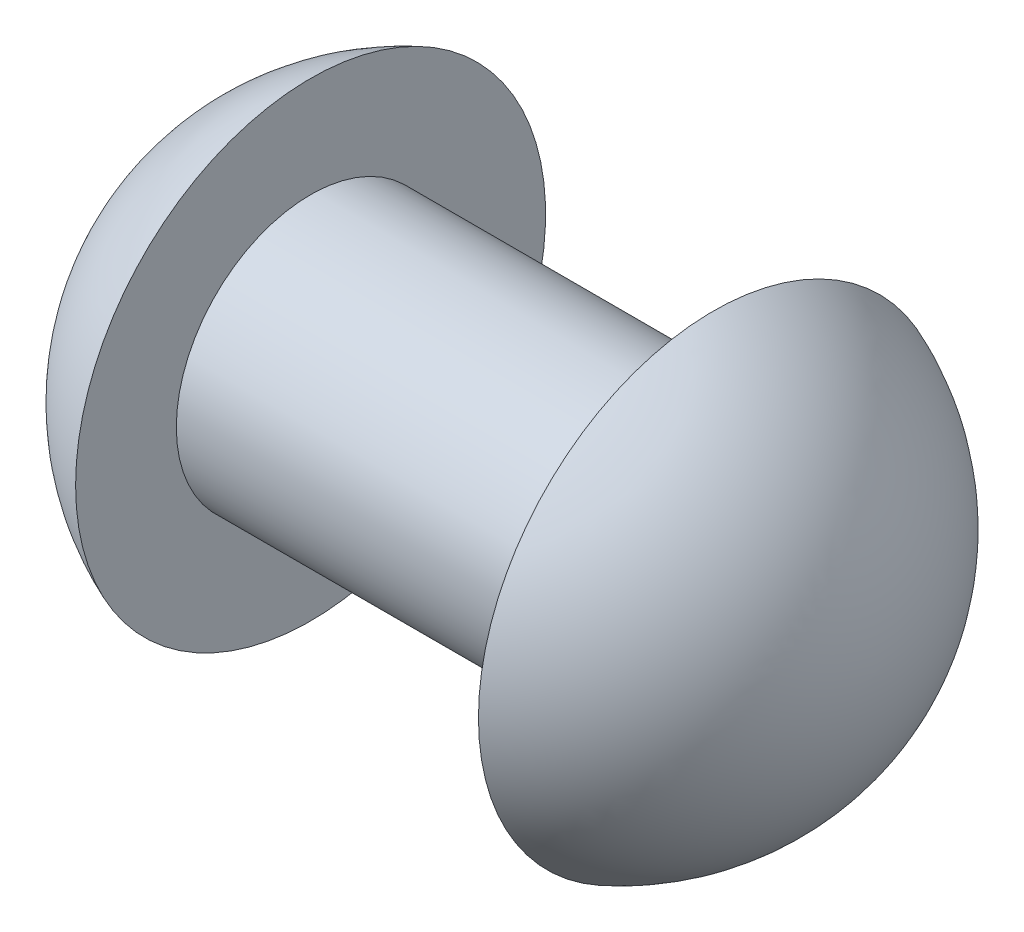
ISO-10303-21;
HEADER;
FILE_DESCRIPTION(('STEP AP214'),'2;1');
FILE_NAME('part.step','',(''),(''),'','','');
FILE_SCHEMA(('AUTOMOTIVE_DESIGN { 1 0 10303 214 1 1 1 1 }'));
ENDSEC;
DATA;
#1=APPLICATION_CONTEXT('core data for automotive mechanical design processes');
#2=APPLICATION_PROTOCOL_DEFINITION('international standard','automotive_design',2000,#1);
#3=PRODUCT_CONTEXT('',#1,'mechanical');
#4=PRODUCT('Part','Part','',(#3));
#5=PRODUCT_RELATED_PRODUCT_CATEGORY('part','',(#4));
#6=PRODUCT_DEFINITION_FORMATION('','',#4);
#7=PRODUCT_DEFINITION_CONTEXT('part definition',#1,'design');
#8=PRODUCT_DEFINITION('design','',#6,#7);
#9=PRODUCT_DEFINITION_SHAPE('','',#8);
#10=(LENGTH_UNIT() NAMED_UNIT(*) SI_UNIT(.MILLI.,.METRE.));
#11=(NAMED_UNIT(*) PLANE_ANGLE_UNIT() SI_UNIT($,.RADIAN.));
#12=(NAMED_UNIT(*) SI_UNIT($,.STERADIAN.) SOLID_ANGLE_UNIT());
#13=UNCERTAINTY_MEASURE_WITH_UNIT(LENGTH_MEASURE(1.E-05),#10,'distance_accuracy_value','');
#14=(GEOMETRIC_REPRESENTATION_CONTEXT(3) GLOBAL_UNCERTAINTY_ASSIGNED_CONTEXT((#13)) GLOBAL_UNIT_ASSIGNED_CONTEXT((#10,
#11,#12)) REPRESENTATION_CONTEXT('',''));
#15=CARTESIAN_POINT('',(0.,0.,0.));
#16=DIRECTION('',(0.,0.,1.));
#17=DIRECTION('',(1.,0.,0.));
#18=AXIS2_PLACEMENT_3D('',#15,#16,#17);
#19=CARTESIAN_POINT('',(-5.24999999999999,0.,0.));
#20=DIRECTION('',(-1.,0.,0.));
#21=DIRECTION('',(0.,0.,1.));
#22=AXIS2_PLACEMENT_3D('',#19,#20,#21);
#23=CYLINDRICAL_SURFACE('',#22,0.1);
#24=CARTESIAN_POINT('',(-1.64999999999999,0.,0.));
#25=DIRECTION('',(-1.,0.,0.));
#26=DIRECTION('',(0.,0.,1.));
#27=AXIS2_PLACEMENT_3D('',#24,#25,#26);
#28=CIRCLE('',#27,0.1);
#29=CARTESIAN_POINT('',(-1.64999999999999,0.,0.0999999999999999));
#30=VERTEX_POINT('',#29);
#31=EDGE_CURVE('E11',#30,#30,#28,.T.);
#32=ORIENTED_EDGE('',*,*,#31,.F.);
#33=EDGE_LOOP('',(#32));
#34=FACE_BOUND('',#33,.T.);
#35=CARTESIAN_POINT('',(-1.34999999999999,0.,0.));
#36=DIRECTION('',(1.,0.,0.));
#37=DIRECTION('',(0.,0.,-1.));
#38=AXIS2_PLACEMENT_3D('',#35,#36,#37);
#39=CIRCLE('',#38,0.1);
#40=CARTESIAN_POINT('',(-1.34999999999999,0.,-0.1));
#41=VERTEX_POINT('',#40);
#42=EDGE_CURVE('E75',#41,#41,#39,.T.);
#43=ORIENTED_EDGE('',*,*,#42,.F.);
#44=EDGE_LOOP('',(#43));
#45=FACE_BOUND('',#44,.T.);
#46=ADVANCED_FACE('F39',(#34,#45),#23,.T.);
#47=CARTESIAN_POINT('',(-1.64999999999999,0.1,0.));
#48=DIRECTION('',(-1.,0.,0.));
#49=DIRECTION('',(0.,0.,1.));
#50=AXIS2_PLACEMENT_3D('',#47,#48,#49);
#51=PLANE('',#50);
#52=CARTESIAN_POINT('',(-1.64999999999999,0.,0.));
#53=DIRECTION('',(-1.,0.,0.));
#54=DIRECTION('',(0.,0.,1.));
#55=AXIS2_PLACEMENT_3D('',#52,#53,#54);
#56=CIRCLE('',#55,0.175);
#57=CARTESIAN_POINT('',(-1.64999999999999,0.,0.175));
#58=VERTEX_POINT('',#57);
#59=EDGE_CURVE('E46',#58,#58,#56,.T.);
#60=ORIENTED_EDGE('',*,*,#59,.F.);
#61=EDGE_LOOP('',(#60));
#62=FACE_BOUND('',#61,.T.);
#63=ORIENTED_EDGE('',*,*,#31,.T.);
#64=EDGE_LOOP('',(#63));
#65=FACE_BOUND('',#64,.T.);
#66=ADVANCED_FACE('F65',(#62,#65),#51,.F.);
#67=CARTESIAN_POINT('',(-1.58000706090588,0.,-0.00163801537881923));
#68=DIRECTION('',(0.,-1.,0.));
#69=DIRECTION('',(0.,0.,1.));
#70=AXIS2_PLACEMENT_3D('',#67,#68,#69);
#71=CIRCLE('',#70,0.19);
#72=TRIMMED_CURVE('',#71,(PARAMETER_VALUE(-1.56217508642582)),
(PARAMETER_VALUE(1.56217508642582)),.T.,.PARAMETER.);
#73=CARTESIAN_POINT('',(-1.58000706090588,0.,0.));
#74=DIRECTION('',(-1.,0.,0.));
#75=AXIS1_PLACEMENT('',#73,#74);
#76=SURFACE_OF_REVOLUTION('',#72,#75);
#77=CARTESIAN_POINT('',(-1.76999999999999,0.,0.));
#78=VERTEX_POINT('',#77);
#79=VERTEX_LOOP('',#78);
#80=FACE_BOUND('',#79,.T.);
#81=ORIENTED_EDGE('',*,*,#59,.T.);
#82=EDGE_LOOP('',(#81));
#83=FACE_BOUND('',#82,.T.);
#84=ADVANCED_FACE('F60',(#80,#83),#76,.T.);
#85=CARTESIAN_POINT('',(-1.34999999999999,0.,0.));
#86=DIRECTION('',(1.,0.,0.));
#87=DIRECTION('',(0.,0.,-1.));
#88=AXIS2_PLACEMENT_3D('',#85,#86,#87);
#89=PLANE('',#88);
#90=ORIENTED_EDGE('',*,*,#42,.T.);
#91=EDGE_LOOP('',(#90));
#92=FACE_BOUND('',#91,.T.);
#93=CARTESIAN_POINT('',(-1.34999999999999,0.,0.));
#94=DIRECTION('',(-1.,0.,0.));
#95=DIRECTION('',(0.,0.,1.));
#96=AXIS2_PLACEMENT_3D('',#93,#94,#95);
#97=CIRCLE('',#96,0.175);
#98=CARTESIAN_POINT('',(-1.34999999999999,0.,0.175));
#99=VERTEX_POINT('',#98);
#100=EDGE_CURVE('E76',#99,#99,#97,.T.);
#101=ORIENTED_EDGE('',*,*,#100,.T.);
#102=EDGE_LOOP('',(#101));
#103=FACE_BOUND('',#102,.T.);
#104=ADVANCED_FACE('F54',(#92,#103),#89,.F.);
#105=CARTESIAN_POINT('',(-1.4199929390941,0.,-0.0016380153788194));
#106=DIRECTION('',(0.,-1.,0.));
#107=DIRECTION('',(0.,0.,1.));
#108=AXIS2_PLACEMENT_3D('',#105,#106,#107);
#109=CIRCLE('',#108,0.19);
#110=TRIMMED_CURVE('',#109,(PARAMETER_VALUE(-1.56217508642582)),
(PARAMETER_VALUE(1.56217508642582)),.T.,.PARAMETER.);
#111=CARTESIAN_POINT('',(-1.4199929390941,0.,0.));
#112=DIRECTION('',(-1.,0.,0.));
#113=AXIS1_PLACEMENT('',#111,#112);
#114=SURFACE_OF_REVOLUTION('',#110,#113);
#115=ORIENTED_EDGE('',*,*,#100,.F.);
#116=EDGE_LOOP('',(#115));
#117=FACE_BOUND('',#116,.T.);
#118=CARTESIAN_POINT('',(-1.22999999999999,0.,0.));
#119=VERTEX_POINT('',#118);
#120=VERTEX_LOOP('',#119);
#121=FACE_BOUND('',#120,.T.);
#122=ADVANCED_FACE('F52',(#117,#121),#114,.T.);
#123=CLOSED_SHELL('',(#46,#66,#84,#104,#122));
#124=MANIFOLD_SOLID_BREP('B2',#123);
#125=ADVANCED_BREP_SHAPE_REPRESENTATION('',(#18,#124),#14);
#126=SHAPE_DEFINITION_REPRESENTATION(#9,#125);
ENDSEC;
END-ISO-10303-21;
